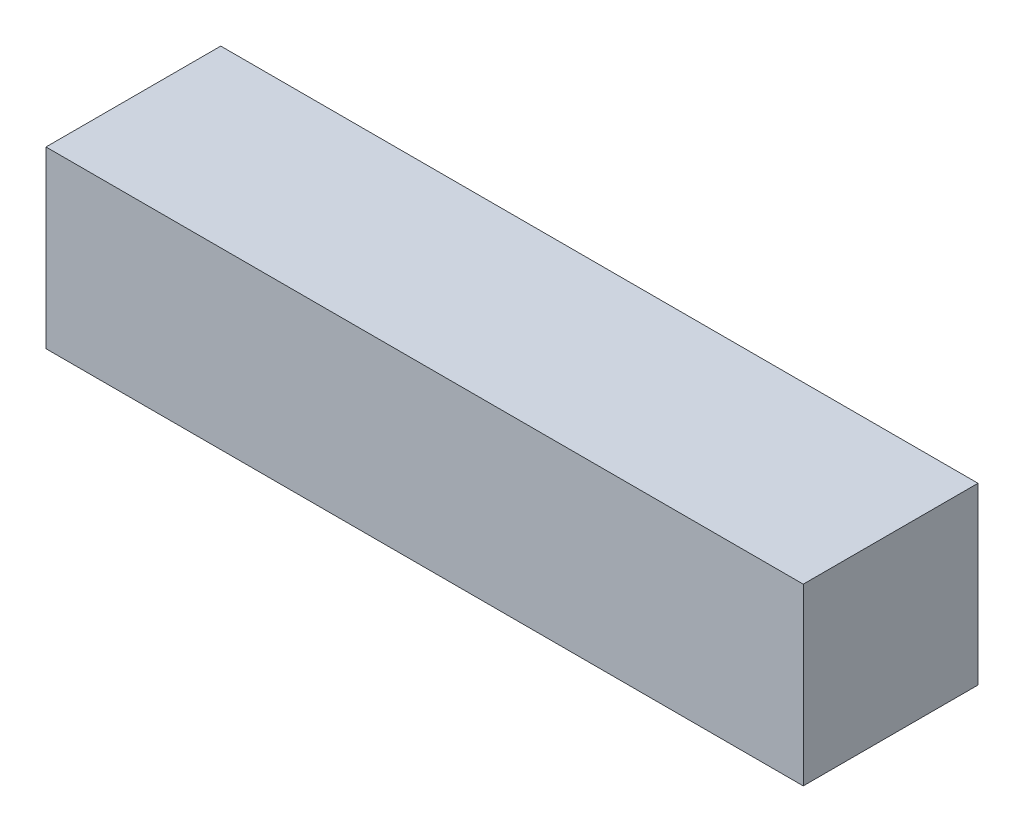
ISO-10303-21;
HEADER;
FILE_DESCRIPTION(('STEP AP214'),'2;1');
FILE_NAME('part.step','',(''),(''),'','','');
FILE_SCHEMA(('AUTOMOTIVE_DESIGN { 1 0 10303 214 1 1 1 1 }'));
ENDSEC;
DATA;
#1=APPLICATION_CONTEXT('core data for automotive mechanical design processes');
#2=APPLICATION_PROTOCOL_DEFINITION('international standard','automotive_design',2000,#1);
#3=PRODUCT_CONTEXT('',#1,'mechanical');
#4=PRODUCT('Part','Part','',(#3));
#5=PRODUCT_RELATED_PRODUCT_CATEGORY('part','',(#4));
#6=PRODUCT_DEFINITION_FORMATION('','',#4);
#7=PRODUCT_DEFINITION_CONTEXT('part definition',#1,'design');
#8=PRODUCT_DEFINITION('design','',#6,#7);
#9=PRODUCT_DEFINITION_SHAPE('','',#8);
#10=(LENGTH_UNIT() NAMED_UNIT(*) SI_UNIT(.MILLI.,.METRE.));
#11=(NAMED_UNIT(*) PLANE_ANGLE_UNIT() SI_UNIT($,.RADIAN.));
#12=(NAMED_UNIT(*) SI_UNIT($,.STERADIAN.) SOLID_ANGLE_UNIT());
#13=UNCERTAINTY_MEASURE_WITH_UNIT(LENGTH_MEASURE(1.E-05),#10,'distance_accuracy_value','');
#14=(GEOMETRIC_REPRESENTATION_CONTEXT(3) GLOBAL_UNCERTAINTY_ASSIGNED_CONTEXT((#13)) GLOBAL_UNIT_ASSIGNED_CONTEXT((#10,
#11,#12)) REPRESENTATION_CONTEXT('',''));
#15=CARTESIAN_POINT('',(0.,0.,0.));
#16=DIRECTION('',(0.,0.,1.));
#17=DIRECTION('',(1.,0.,0.));
#18=AXIS2_PLACEMENT_3D('',#15,#16,#17);
#19=CARTESIAN_POINT('',(-82.55,19.05,38.1));
#20=DIRECTION('',(1.,0.,0.));
#21=DIRECTION('',(0.,0.,-1.));
#22=AXIS2_PLACEMENT_3D('',#19,#20,#21);
#23=PLANE('',#22);
#24=DIRECTION('',(0.,-1.,0.));
#25=VECTOR('',#24,1.);
#26=CARTESIAN_POINT('',(-82.55,19.05,0.));
#27=LINE('',#26,#25);
#28=CARTESIAN_POINT('',(-82.55,19.05,0.));
#29=VERTEX_POINT('',#28);
#30=CARTESIAN_POINT('',(-82.55,-19.05,0.));
#31=VERTEX_POINT('',#30);
#32=EDGE_CURVE('E95',#29,#31,#27,.T.);
#33=ORIENTED_EDGE('',*,*,#32,.T.);
#34=DIRECTION('',(0.,0.,-1.));
#35=VECTOR('',#34,1.);
#36=CARTESIAN_POINT('',(-82.55,-19.05,38.1));
#37=LINE('',#36,#35);
#38=CARTESIAN_POINT('',(-82.55,-19.05,38.1));
#39=VERTEX_POINT('',#38);
#40=EDGE_CURVE('E11',#39,#31,#37,.T.);
#41=ORIENTED_EDGE('',*,*,#40,.F.);
#42=DIRECTION('',(0.,-1.,0.));
#43=VECTOR('',#42,1.);
#44=CARTESIAN_POINT('',(-82.55,19.05,38.1));
#45=LINE('',#44,#43);
#46=CARTESIAN_POINT('',(-82.55,19.05,38.1));
#47=VERTEX_POINT('',#46);
#48=EDGE_CURVE('E83',#47,#39,#45,.T.);
#49=ORIENTED_EDGE('',*,*,#48,.F.);
#50=DIRECTION('',(0.,0.,-1.));
#51=VECTOR('',#50,1.);
#52=CARTESIAN_POINT('',(-82.55,19.05,38.1));
#53=LINE('',#52,#51);
#54=EDGE_CURVE('E91',#47,#29,#53,.T.);
#55=ORIENTED_EDGE('',*,*,#54,.T.);
#56=EDGE_LOOP('',(#33,#41,#49,#55));
#57=FACE_BOUND('',#56,.T.);
#58=ADVANCED_FACE('F32',(#57),#23,.F.);
#59=CARTESIAN_POINT('',(-82.55,-19.05,38.1));
#60=DIRECTION('',(0.,1.,0.));
#61=DIRECTION('',(-1.,0.,0.));
#62=AXIS2_PLACEMENT_3D('',#59,#60,#61);
#63=PLANE('',#62);
#64=DIRECTION('',(1.,0.,0.));
#65=VECTOR('',#64,1.);
#66=CARTESIAN_POINT('',(-82.55,-19.05,0.));
#67=LINE('',#66,#65);
#68=CARTESIAN_POINT('',(82.55,-19.05,0.));
#69=VERTEX_POINT('',#68);
#70=EDGE_CURVE('E87',#31,#69,#67,.T.);
#71=ORIENTED_EDGE('',*,*,#70,.T.);
#72=DIRECTION('',(0.,0.,-1.));
#73=VECTOR('',#72,1.);
#74=CARTESIAN_POINT('',(82.55,-19.05,38.1));
#75=LINE('',#74,#73);
#76=CARTESIAN_POINT('',(82.55,-19.05,38.1));
#77=VERTEX_POINT('',#76);
#78=EDGE_CURVE('E40',#77,#69,#75,.T.);
#79=ORIENTED_EDGE('',*,*,#78,.F.);
#80=DIRECTION('',(1.,0.,0.));
#81=VECTOR('',#80,1.);
#82=CARTESIAN_POINT('',(-82.55,-19.05,38.1));
#83=LINE('',#82,#81);
#84=EDGE_CURVE('E78',#39,#77,#83,.T.);
#85=ORIENTED_EDGE('',*,*,#84,.F.);
#86=ORIENTED_EDGE('',*,*,#40,.T.);
#87=EDGE_LOOP('',(#71,#79,#85,#86));
#88=FACE_BOUND('',#87,.T.);
#89=ADVANCED_FACE('F86',(#88),#63,.F.);
#90=CARTESIAN_POINT('',(82.55,19.05,38.1));
#91=DIRECTION('',(-1.,0.,0.));
#92=DIRECTION('',(0.,0.,1.));
#93=AXIS2_PLACEMENT_3D('',#90,#91,#92);
#94=PLANE('',#93);
#95=DIRECTION('',(0.,1.,0.));
#96=VECTOR('',#95,1.);
#97=CARTESIAN_POINT('',(82.55,19.05,0.));
#98=LINE('',#97,#96);
#99=CARTESIAN_POINT('',(82.55,19.05,0.));
#100=VERTEX_POINT('',#99);
#101=EDGE_CURVE('E65',#69,#100,#98,.T.);
#102=ORIENTED_EDGE('',*,*,#101,.T.);
#103=DIRECTION('',(0.,0.,-1.));
#104=VECTOR('',#103,1.);
#105=CARTESIAN_POINT('',(82.55,19.05,38.1));
#106=LINE('',#105,#104);
#107=CARTESIAN_POINT('',(82.55,19.05,38.1));
#108=VERTEX_POINT('',#107);
#109=EDGE_CURVE('E88',#108,#100,#106,.T.);
#110=ORIENTED_EDGE('',*,*,#109,.F.);
#111=DIRECTION('',(0.,1.,0.));
#112=VECTOR('',#111,1.);
#113=CARTESIAN_POINT('',(82.55,19.05,38.1));
#114=LINE('',#113,#112);
#115=EDGE_CURVE('E81',#77,#108,#114,.T.);
#116=ORIENTED_EDGE('',*,*,#115,.F.);
#117=ORIENTED_EDGE('',*,*,#78,.T.);
#118=EDGE_LOOP('',(#102,#110,#116,#117));
#119=FACE_BOUND('',#118,.T.);
#120=ADVANCED_FACE('F89',(#119),#94,.F.);
#121=CARTESIAN_POINT('',(-82.55,19.05,38.1));
#122=DIRECTION('',(0.,-1.,0.));
#123=DIRECTION('',(1.,0.,0.));
#124=AXIS2_PLACEMENT_3D('',#121,#122,#123);
#125=PLANE('',#124);
#126=DIRECTION('',(-1.,0.,0.));
#127=VECTOR('',#126,1.);
#128=CARTESIAN_POINT('',(-82.55,19.05,0.));
#129=LINE('',#128,#127);
#130=EDGE_CURVE('E71',#100,#29,#129,.T.);
#131=ORIENTED_EDGE('',*,*,#130,.T.);
#132=ORIENTED_EDGE('',*,*,#54,.F.);
#133=DIRECTION('',(-1.,0.,0.));
#134=VECTOR('',#133,1.);
#135=CARTESIAN_POINT('',(-82.55,19.05,38.1));
#136=LINE('',#135,#134);
#137=EDGE_CURVE('E48',#108,#47,#136,.T.);
#138=ORIENTED_EDGE('',*,*,#137,.F.);
#139=ORIENTED_EDGE('',*,*,#109,.T.);
#140=EDGE_LOOP('',(#131,#132,#138,#139));
#141=FACE_BOUND('',#140,.T.);
#142=ADVANCED_FACE('F102',(#141),#125,.F.);
#143=CARTESIAN_POINT('',(0.,0.,38.1));
#144=DIRECTION('',(0.,0.,1.));
#145=DIRECTION('',(1.,0.,0.));
#146=AXIS2_PLACEMENT_3D('',#143,#144,#145);
#147=PLANE('',#146);
#148=ORIENTED_EDGE('',*,*,#48,.T.);
#149=ORIENTED_EDGE('',*,*,#84,.T.);
#150=ORIENTED_EDGE('',*,*,#115,.T.);
#151=ORIENTED_EDGE('',*,*,#137,.T.);
#152=EDGE_LOOP('',(#148,#149,#150,#151));
#153=FACE_BOUND('',#152,.T.);
#154=ADVANCED_FACE('F79',(#153),#147,.T.);
#155=CARTESIAN_POINT('',(0.,0.,0.));
#156=DIRECTION('',(0.,0.,1.));
#157=DIRECTION('',(1.,0.,0.));
#158=AXIS2_PLACEMENT_3D('',#155,#156,#157);
#159=PLANE('',#158);
#160=ORIENTED_EDGE('',*,*,#32,.F.);
#161=ORIENTED_EDGE('',*,*,#130,.F.);
#162=ORIENTED_EDGE('',*,*,#101,.F.);
#163=ORIENTED_EDGE('',*,*,#70,.F.);
#164=EDGE_LOOP('',(#160,#161,#162,#163));
#165=FACE_BOUND('',#164,.T.);
#166=ADVANCED_FACE('F105',(#165),#159,.F.);
#167=CLOSED_SHELL('',(#58,#89,#120,#142,#154,#166));
#168=MANIFOLD_SOLID_BREP('B2',#167);
#169=ADVANCED_BREP_SHAPE_REPRESENTATION('',(#18,#168),#14);
#170=SHAPE_DEFINITION_REPRESENTATION(#9,#169);
ENDSEC;
END-ISO-10303-21;
